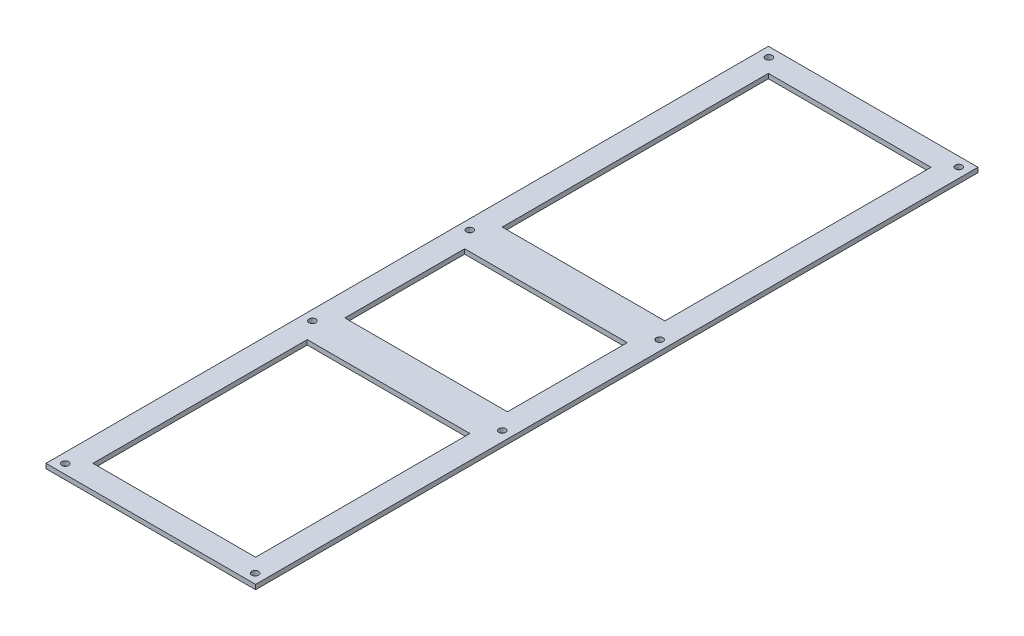
ISO-10303-21;
HEADER;
FILE_DESCRIPTION(('STEP AP214'),'2;1');
FILE_NAME('part.step','',(''),(''),'','','');
FILE_SCHEMA(('AUTOMOTIVE_DESIGN { 1 0 10303 214 1 1 1 1 }'));
ENDSEC;
DATA;
#1=APPLICATION_CONTEXT('core data for automotive mechanical design processes');
#2=APPLICATION_PROTOCOL_DEFINITION('international standard','automotive_design',2000,#1);
#3=PRODUCT_CONTEXT('',#1,'mechanical');
#4=PRODUCT('Part','Part','',(#3));
#5=PRODUCT_RELATED_PRODUCT_CATEGORY('part','',(#4));
#6=PRODUCT_DEFINITION_FORMATION('','',#4);
#7=PRODUCT_DEFINITION_CONTEXT('part definition',#1,'design');
#8=PRODUCT_DEFINITION('design','',#6,#7);
#9=PRODUCT_DEFINITION_SHAPE('','',#8);
#10=(LENGTH_UNIT() NAMED_UNIT(*) SI_UNIT(.MILLI.,.METRE.));
#11=(NAMED_UNIT(*) PLANE_ANGLE_UNIT() SI_UNIT($,.RADIAN.));
#12=(NAMED_UNIT(*) SI_UNIT($,.STERADIAN.) SOLID_ANGLE_UNIT());
#13=UNCERTAINTY_MEASURE_WITH_UNIT(LENGTH_MEASURE(1.E-05),#10,'distance_accuracy_value','');
#14=(GEOMETRIC_REPRESENTATION_CONTEXT(3) GLOBAL_UNCERTAINTY_ASSIGNED_CONTEXT((#13)) GLOBAL_UNIT_ASSIGNED_CONTEXT((#10,
#11,#12)) REPRESENTATION_CONTEXT('',''));
#15=CARTESIAN_POINT('',(0.,0.,0.));
#16=DIRECTION('',(0.,0.,1.));
#17=DIRECTION('',(1.,0.,0.));
#18=AXIS2_PLACEMENT_3D('',#15,#16,#17);
#19=CARTESIAN_POINT('',(0.,2.,0.));
#20=DIRECTION('',(0.,-1.,0.));
#21=DIRECTION('',(0.,0.,-1.));
#22=AXIS2_PLACEMENT_3D('',#19,#20,#21);
#23=PLANE('',#22);
#24=CARTESIAN_POINT('',(85.025,2.,-4.));
#25=DIRECTION('',(0.,1.,0.));
#26=DIRECTION('',(0.,0.,1.));
#27=AXIS2_PLACEMENT_3D('',#24,#25,#26);
#28=CIRCLE('',#27,1.44999999999999);
#29=CARTESIAN_POINT('',(85.025,2.,-2.55000000000001));
#30=VERTEX_POINT('',#29);
#31=EDGE_CURVE('E412',#30,#30,#28,.T.);
#32=ORIENTED_EDGE('',*,*,#31,.F.);
#33=EDGE_LOOP('',(#32));
#34=FACE_BOUND('',#33,.T.);
#35=CARTESIAN_POINT('',(4.2,2.,-4.));
#36=DIRECTION('',(0.,1.,0.));
#37=DIRECTION('',(0.,0.,1.));
#38=AXIS2_PLACEMENT_3D('',#35,#36,#37);
#39=CIRCLE('',#38,1.44999999999999);
#40=CARTESIAN_POINT('',(4.2,2.,-2.55000000000001));
#41=VERTEX_POINT('',#40);
#42=EDGE_CURVE('E414',#41,#41,#39,.T.);
#43=ORIENTED_EDGE('',*,*,#42,.F.);
#44=EDGE_LOOP('',(#43));
#45=FACE_BOUND('',#44,.T.);
#46=CARTESIAN_POINT('',(4.2,2.,-109.2));
#47=DIRECTION('',(0.,1.,0.));
#48=DIRECTION('',(0.,0.,1.));
#49=AXIS2_PLACEMENT_3D('',#46,#47,#48);
#50=CIRCLE('',#49,1.44999999999999);
#51=CARTESIAN_POINT('',(4.2,2.,-107.75));
#52=VERTEX_POINT('',#51);
#53=EDGE_CURVE('E422',#52,#52,#50,.T.);
#54=ORIENTED_EDGE('',*,*,#53,.F.);
#55=EDGE_LOOP('',(#54));
#56=FACE_BOUND('',#55,.T.);
#57=CARTESIAN_POINT('',(4.2,2.,-176.2));
#58=DIRECTION('',(0.,1.,0.));
#59=DIRECTION('',(0.,0.,1.));
#60=AXIS2_PLACEMENT_3D('',#57,#58,#59);
#61=CIRCLE('',#60,1.44999999999999);
#62=CARTESIAN_POINT('',(4.2,2.,-174.75));
#63=VERTEX_POINT('',#62);
#64=EDGE_CURVE('E428',#63,#63,#61,.T.);
#65=ORIENTED_EDGE('',*,*,#64,.F.);
#66=EDGE_LOOP('',(#65));
#67=FACE_BOUND('',#66,.T.);
#68=CARTESIAN_POINT('',(4.2,2.,-303.5));
#69=DIRECTION('',(0.,1.,0.));
#70=DIRECTION('',(0.,0.,1.));
#71=AXIS2_PLACEMENT_3D('',#68,#69,#70);
#72=CIRCLE('',#71,1.44999999999999);
#73=CARTESIAN_POINT('',(4.2,2.,-302.05));
#74=VERTEX_POINT('',#73);
#75=EDGE_CURVE('E434',#74,#74,#72,.T.);
#76=ORIENTED_EDGE('',*,*,#75,.F.);
#77=EDGE_LOOP('',(#76));
#78=FACE_BOUND('',#77,.T.);
#79=CARTESIAN_POINT('',(85.025,2.,-303.5));
#80=DIRECTION('',(0.,1.,0.));
#81=DIRECTION('',(0.,0.,1.));
#82=AXIS2_PLACEMENT_3D('',#79,#80,#81);
#83=CIRCLE('',#82,1.44999999999999);
#84=CARTESIAN_POINT('',(85.025,2.,-302.05));
#85=VERTEX_POINT('',#84);
#86=EDGE_CURVE('E440',#85,#85,#83,.T.);
#87=ORIENTED_EDGE('',*,*,#86,.F.);
#88=EDGE_LOOP('',(#87));
#89=FACE_BOUND('',#88,.T.);
#90=CARTESIAN_POINT('',(85.025,2.,-176.2));
#91=DIRECTION('',(0.,1.,0.));
#92=DIRECTION('',(0.,0.,1.));
#93=AXIS2_PLACEMENT_3D('',#90,#91,#92);
#94=CIRCLE('',#93,1.44999999999999);
#95=CARTESIAN_POINT('',(85.025,2.,-174.75));
#96=VERTEX_POINT('',#95);
#97=EDGE_CURVE('E446',#96,#96,#94,.T.);
#98=ORIENTED_EDGE('',*,*,#97,.F.);
#99=EDGE_LOOP('',(#98));
#100=FACE_BOUND('',#99,.T.);
#101=CARTESIAN_POINT('',(85.025,2.,-109.2));
#102=DIRECTION('',(0.,1.,0.));
#103=DIRECTION('',(0.,0.,1.));
#104=AXIS2_PLACEMENT_3D('',#101,#102,#103);
#105=CIRCLE('',#104,1.44999999999999);
#106=CARTESIAN_POINT('',(85.025,2.,-107.75));
#107=VERTEX_POINT('',#106);
#108=EDGE_CURVE('E452',#107,#107,#105,.T.);
#109=ORIENTED_EDGE('',*,*,#108,.F.);
#110=EDGE_LOOP('',(#109));
#111=FACE_BOUND('',#110,.T.);
#112=DIRECTION('',(0.,0.,1.));
#113=VECTOR('',#112,1.);
#114=CARTESIAN_POINT('',(10.,2.,-117.2));
#115=LINE('',#114,#113);
#116=CARTESIAN_POINT('',(10.,2.,-168.2));
#117=VERTEX_POINT('',#116);
#118=CARTESIAN_POINT('',(10.,2.,-117.2));
#119=VERTEX_POINT('',#118);
#120=EDGE_CURVE('E189',#117,#119,#115,.T.);
#121=ORIENTED_EDGE('',*,*,#120,.F.);
#122=DIRECTION('',(-1.,0.,0.));
#123=VECTOR('',#122,1.);
#124=CARTESIAN_POINT('',(10.,2.,-168.2));
#125=LINE('',#124,#123);
#126=CARTESIAN_POINT('',(79.2250000000001,2.,-168.2));
#127=VERTEX_POINT('',#126);
#128=EDGE_CURVE('E197',#127,#117,#125,.T.);
#129=ORIENTED_EDGE('',*,*,#128,.F.);
#130=DIRECTION('',(0.,0.,-1.));
#131=VECTOR('',#130,1.);
#132=CARTESIAN_POINT('',(79.2250000000001,2.,-117.2));
#133=LINE('',#132,#131);
#134=CARTESIAN_POINT('',(79.2250000000001,2.,-117.2));
#135=VERTEX_POINT('',#134);
#136=EDGE_CURVE('E194',#135,#127,#133,.T.);
#137=ORIENTED_EDGE('',*,*,#136,.F.);
#138=DIRECTION('',(1.,0.,0.));
#139=VECTOR('',#138,1.);
#140=CARTESIAN_POINT('',(10.,2.,-117.2));
#141=LINE('',#140,#139);
#142=EDGE_CURVE('E191',#119,#135,#141,.T.);
#143=ORIENTED_EDGE('',*,*,#142,.F.);
#144=EDGE_LOOP('',(#121,#129,#137,#143));
#145=FACE_BOUND('',#144,.T.);
#146=DIRECTION('',(0.,0.,1.));
#147=VECTOR('',#146,1.);
#148=CARTESIAN_POINT('',(0.,2.,0.));
#149=LINE('',#148,#147);
#150=CARTESIAN_POINT('',(0.,2.,-307.5));
#151=VERTEX_POINT('',#150);
#152=CARTESIAN_POINT('',(0.,2.,0.));
#153=VERTEX_POINT('',#152);
#154=EDGE_CURVE('E251',#151,#153,#149,.T.);
#155=ORIENTED_EDGE('',*,*,#154,.T.);
#156=DIRECTION('',(1.,0.,0.));
#157=VECTOR('',#156,1.);
#158=CARTESIAN_POINT('',(0.,2.,0.));
#159=LINE('',#158,#157);
#160=CARTESIAN_POINT('',(89.225,2.,0.));
#161=VERTEX_POINT('',#160);
#162=EDGE_CURVE('E254',#153,#161,#159,.T.);
#163=ORIENTED_EDGE('',*,*,#162,.T.);
#164=DIRECTION('',(0.,0.,-1.));
#165=VECTOR('',#164,1.);
#166=CARTESIAN_POINT('',(89.225,2.,0.));
#167=LINE('',#166,#165);
#168=CARTESIAN_POINT('',(89.225,2.,-307.5));
#169=VERTEX_POINT('',#168);
#170=EDGE_CURVE('E257',#161,#169,#167,.T.);
#171=ORIENTED_EDGE('',*,*,#170,.T.);
#172=DIRECTION('',(-1.,0.,0.));
#173=VECTOR('',#172,1.);
#174=CARTESIAN_POINT('',(0.,2.,-307.5));
#175=LINE('',#174,#173);
#176=EDGE_CURVE('E259',#169,#151,#175,.T.);
#177=ORIENTED_EDGE('',*,*,#176,.T.);
#178=EDGE_LOOP('',(#155,#163,#171,#177));
#179=FACE_BOUND('',#178,.T.);
#180=DIRECTION('',(1.,0.,0.));
#181=VECTOR('',#180,1.);
#182=CARTESIAN_POINT('',(10.,2.,-10.));
#183=LINE('',#182,#181);
#184=CARTESIAN_POINT('',(10.,2.,-10.));
#185=VERTEX_POINT('',#184);
#186=CARTESIAN_POINT('',(79.2250000000001,2.,-10.));
#187=VERTEX_POINT('',#186);
#188=EDGE_CURVE('E222',#185,#187,#183,.T.);
#189=ORIENTED_EDGE('',*,*,#188,.F.);
#190=DIRECTION('',(0.,0.,1.));
#191=VECTOR('',#190,1.);
#192=CARTESIAN_POINT('',(10.,2.,-10.));
#193=LINE('',#192,#191);
#194=CARTESIAN_POINT('',(10.,2.,-101.2));
#195=VERTEX_POINT('',#194);
#196=EDGE_CURVE('E220',#195,#185,#193,.T.);
#197=ORIENTED_EDGE('',*,*,#196,.F.);
#198=DIRECTION('',(-1.,0.,0.));
#199=VECTOR('',#198,1.);
#200=CARTESIAN_POINT('',(10.,2.,-101.2));
#201=LINE('',#200,#199);
#202=CARTESIAN_POINT('',(79.2250000000001,2.,-101.2));
#203=VERTEX_POINT('',#202);
#204=EDGE_CURVE('E227',#203,#195,#201,.T.);
#205=ORIENTED_EDGE('',*,*,#204,.F.);
#206=DIRECTION('',(0.,0.,-1.));
#207=VECTOR('',#206,1.);
#208=CARTESIAN_POINT('',(79.2250000000001,2.,-10.));
#209=LINE('',#208,#207);
#210=EDGE_CURVE('E225',#187,#203,#209,.T.);
#211=ORIENTED_EDGE('',*,*,#210,.F.);
#212=EDGE_LOOP('',(#189,#197,#205,#211));
#213=FACE_BOUND('',#212,.T.);
#214=DIRECTION('',(0.,0.,1.));
#215=VECTOR('',#214,1.);
#216=CARTESIAN_POINT('',(10.,2.,-297.5));
#217=LINE('',#216,#215);
#218=CARTESIAN_POINT('',(10.,2.,-297.5));
#219=VERTEX_POINT('',#218);
#220=CARTESIAN_POINT('',(10.,2.,-184.2));
#221=VERTEX_POINT('',#220);
#222=EDGE_CURVE('E148',#219,#221,#217,.T.);
#223=ORIENTED_EDGE('',*,*,#222,.F.);
#224=DIRECTION('',(-1.,0.,0.));
#225=VECTOR('',#224,1.);
#226=CARTESIAN_POINT('',(10.,2.,-297.5));
#227=LINE('',#226,#225);
#228=CARTESIAN_POINT('',(79.225,2.,-297.5));
#229=VERTEX_POINT('',#228);
#230=EDGE_CURVE('E172',#229,#219,#227,.T.);
#231=ORIENTED_EDGE('',*,*,#230,.F.);
#232=DIRECTION('',(0.,0.,-1.));
#233=VECTOR('',#232,1.);
#234=CARTESIAN_POINT('',(79.225,2.,-209.2));
#235=LINE('',#234,#233);
#236=CARTESIAN_POINT('',(79.225,2.,-184.2));
#237=VERTEX_POINT('',#236);
#238=EDGE_CURVE('E170',#237,#229,#235,.T.);
#239=ORIENTED_EDGE('',*,*,#238,.F.);
#240=DIRECTION('',(1.,0.,0.));
#241=VECTOR('',#240,1.);
#242=CARTESIAN_POINT('',(10.,2.,-184.2));
#243=LINE('',#242,#241);
#244=EDGE_CURVE('E156',#221,#237,#243,.T.);
#245=ORIENTED_EDGE('',*,*,#244,.F.);
#246=EDGE_LOOP('',(#223,#231,#239,#245));
#247=FACE_BOUND('',#246,.T.);
#248=ADVANCED_FACE('F37',(#34,#45,#56,#67,#78,#89,#100,#111,#145,#179,#213,#247),#23,.F.);
#249=CARTESIAN_POINT('',(0.,0.,0.));
#250=DIRECTION('',(0.,-1.,0.));
#251=DIRECTION('',(0.,0.,-1.));
#252=AXIS2_PLACEMENT_3D('',#249,#250,#251);
#253=PLANE('',#252);
#254=CARTESIAN_POINT('',(85.025,0.,-4.));
#255=DIRECTION('',(0.,1.,0.));
#256=DIRECTION('',(0.,0.,1.));
#257=AXIS2_PLACEMENT_3D('',#254,#255,#256);
#258=CIRCLE('',#257,1.44999999999999);
#259=CARTESIAN_POINT('',(85.025,0.,-2.55000000000001));
#260=VERTEX_POINT('',#259);
#261=EDGE_CURVE('E410',#260,#260,#258,.T.);
#262=ORIENTED_EDGE('',*,*,#261,.T.);
#263=EDGE_LOOP('',(#262));
#264=FACE_BOUND('',#263,.T.);
#265=CARTESIAN_POINT('',(4.2,0.,-4.));
#266=DIRECTION('',(0.,1.,0.));
#267=DIRECTION('',(0.,0.,1.));
#268=AXIS2_PLACEMENT_3D('',#265,#266,#267);
#269=CIRCLE('',#268,1.44999999999999);
#270=CARTESIAN_POINT('',(4.2,0.,-2.55000000000001));
#271=VERTEX_POINT('',#270);
#272=EDGE_CURVE('E419',#271,#271,#269,.T.);
#273=ORIENTED_EDGE('',*,*,#272,.T.);
#274=EDGE_LOOP('',(#273));
#275=FACE_BOUND('',#274,.T.);
#276=CARTESIAN_POINT('',(4.2,0.,-109.2));
#277=DIRECTION('',(0.,1.,0.));
#278=DIRECTION('',(0.,0.,1.));
#279=AXIS2_PLACEMENT_3D('',#276,#277,#278);
#280=CIRCLE('',#279,1.44999999999999);
#281=CARTESIAN_POINT('',(4.2,0.,-107.75));
#282=VERTEX_POINT('',#281);
#283=EDGE_CURVE('E425',#282,#282,#280,.T.);
#284=ORIENTED_EDGE('',*,*,#283,.T.);
#285=EDGE_LOOP('',(#284));
#286=FACE_BOUND('',#285,.T.);
#287=CARTESIAN_POINT('',(4.2,0.,-176.2));
#288=DIRECTION('',(0.,1.,0.));
#289=DIRECTION('',(0.,0.,1.));
#290=AXIS2_PLACEMENT_3D('',#287,#288,#289);
#291=CIRCLE('',#290,1.44999999999999);
#292=CARTESIAN_POINT('',(4.2,0.,-174.75));
#293=VERTEX_POINT('',#292);
#294=EDGE_CURVE('E431',#293,#293,#291,.T.);
#295=ORIENTED_EDGE('',*,*,#294,.T.);
#296=EDGE_LOOP('',(#295));
#297=FACE_BOUND('',#296,.T.);
#298=CARTESIAN_POINT('',(4.2,0.,-303.5));
#299=DIRECTION('',(0.,1.,0.));
#300=DIRECTION('',(0.,0.,1.));
#301=AXIS2_PLACEMENT_3D('',#298,#299,#300);
#302=CIRCLE('',#301,1.44999999999999);
#303=CARTESIAN_POINT('',(4.2,0.,-302.05));
#304=VERTEX_POINT('',#303);
#305=EDGE_CURVE('E437',#304,#304,#302,.T.);
#306=ORIENTED_EDGE('',*,*,#305,.T.);
#307=EDGE_LOOP('',(#306));
#308=FACE_BOUND('',#307,.T.);
#309=CARTESIAN_POINT('',(85.025,0.,-303.5));
#310=DIRECTION('',(0.,1.,0.));
#311=DIRECTION('',(0.,0.,1.));
#312=AXIS2_PLACEMENT_3D('',#309,#310,#311);
#313=CIRCLE('',#312,1.44999999999999);
#314=CARTESIAN_POINT('',(85.025,0.,-302.05));
#315=VERTEX_POINT('',#314);
#316=EDGE_CURVE('E443',#315,#315,#313,.T.);
#317=ORIENTED_EDGE('',*,*,#316,.T.);
#318=EDGE_LOOP('',(#317));
#319=FACE_BOUND('',#318,.T.);
#320=CARTESIAN_POINT('',(85.025,0.,-176.2));
#321=DIRECTION('',(0.,1.,0.));
#322=DIRECTION('',(0.,0.,1.));
#323=AXIS2_PLACEMENT_3D('',#320,#321,#322);
#324=CIRCLE('',#323,1.44999999999999);
#325=CARTESIAN_POINT('',(85.025,0.,-174.75));
#326=VERTEX_POINT('',#325);
#327=EDGE_CURVE('E449',#326,#326,#324,.T.);
#328=ORIENTED_EDGE('',*,*,#327,.T.);
#329=EDGE_LOOP('',(#328));
#330=FACE_BOUND('',#329,.T.);
#331=CARTESIAN_POINT('',(85.025,0.,-109.2));
#332=DIRECTION('',(0.,1.,0.));
#333=DIRECTION('',(0.,0.,1.));
#334=AXIS2_PLACEMENT_3D('',#331,#332,#333);
#335=CIRCLE('',#334,1.44999999999999);
#336=CARTESIAN_POINT('',(85.025,0.,-107.75));
#337=VERTEX_POINT('',#336);
#338=EDGE_CURVE('E179',#337,#337,#335,.T.);
#339=ORIENTED_EDGE('',*,*,#338,.T.);
#340=EDGE_LOOP('',(#339));
#341=FACE_BOUND('',#340,.T.);
#342=DIRECTION('',(0.,0.,1.));
#343=VECTOR('',#342,1.);
#344=CARTESIAN_POINT('',(0.,0.,0.));
#345=LINE('',#344,#343);
#346=CARTESIAN_POINT('',(0.,0.,-307.5));
#347=VERTEX_POINT('',#346);
#348=CARTESIAN_POINT('',(0.,0.,0.));
#349=VERTEX_POINT('',#348);
#350=EDGE_CURVE('E250',#347,#349,#345,.T.);
#351=ORIENTED_EDGE('',*,*,#350,.F.);
#352=DIRECTION('',(-1.,0.,0.));
#353=VECTOR('',#352,1.);
#354=CARTESIAN_POINT('',(0.,0.,-307.5));
#355=LINE('',#354,#353);
#356=CARTESIAN_POINT('',(89.225,0.,-307.5));
#357=VERTEX_POINT('',#356);
#358=EDGE_CURVE('E255',#357,#347,#355,.T.);
#359=ORIENTED_EDGE('',*,*,#358,.F.);
#360=DIRECTION('',(0.,0.,-1.));
#361=VECTOR('',#360,1.);
#362=CARTESIAN_POINT('',(89.225,0.,0.));
#363=LINE('',#362,#361);
#364=CARTESIAN_POINT('',(89.225,0.,0.));
#365=VERTEX_POINT('',#364);
#366=EDGE_CURVE('E266',#365,#357,#363,.T.);
#367=ORIENTED_EDGE('',*,*,#366,.F.);
#368=DIRECTION('',(1.,0.,0.));
#369=VECTOR('',#368,1.);
#370=CARTESIAN_POINT('',(0.,0.,0.));
#371=LINE('',#370,#369);
#372=EDGE_CURVE('E264',#349,#365,#371,.T.);
#373=ORIENTED_EDGE('',*,*,#372,.F.);
#374=EDGE_LOOP('',(#351,#359,#367,#373));
#375=FACE_BOUND('',#374,.T.);
#376=DIRECTION('',(0.,0.,1.));
#377=VECTOR('',#376,1.);
#378=CARTESIAN_POINT('',(10.,0.,-21.8));
#379=LINE('',#378,#377);
#380=CARTESIAN_POINT('',(10.,0.,-101.2));
#381=VERTEX_POINT('',#380);
#382=CARTESIAN_POINT('',(10.,0.,-10.));
#383=VERTEX_POINT('',#382);
#384=EDGE_CURVE('E223',#381,#383,#379,.T.);
#385=ORIENTED_EDGE('',*,*,#384,.T.);
#386=DIRECTION('',(1.,0.,0.));
#387=VECTOR('',#386,1.);
#388=CARTESIAN_POINT('',(10.,0.,-10.));
#389=LINE('',#388,#387);
#390=CARTESIAN_POINT('',(79.2250000000001,0.,-10.));
#391=VERTEX_POINT('',#390);
#392=EDGE_CURVE('E219',#383,#391,#389,.T.);
#393=ORIENTED_EDGE('',*,*,#392,.T.);
#394=DIRECTION('',(0.,0.,-1.));
#395=VECTOR('',#394,1.);
#396=CARTESIAN_POINT('',(79.2250000000001,0.,-81.2));
#397=LINE('',#396,#395);
#398=CARTESIAN_POINT('',(79.2250000000001,0.,-101.2));
#399=VERTEX_POINT('',#398);
#400=EDGE_CURVE('E233',#391,#399,#397,.T.);
#401=ORIENTED_EDGE('',*,*,#400,.T.);
#402=DIRECTION('',(-1.,0.,0.));
#403=VECTOR('',#402,1.);
#404=CARTESIAN_POINT('',(10.,0.,-101.2));
#405=LINE('',#404,#403);
#406=EDGE_CURVE('E236',#399,#381,#405,.T.);
#407=ORIENTED_EDGE('',*,*,#406,.T.);
#408=EDGE_LOOP('',(#385,#393,#401,#407));
#409=FACE_BOUND('',#408,.T.);
#410=DIRECTION('',(-1.,0.,0.));
#411=VECTOR('',#410,1.);
#412=CARTESIAN_POINT('',(10.,0.,-168.2));
#413=LINE('',#412,#411);
#414=CARTESIAN_POINT('',(79.2250000000001,0.,-168.2));
#415=VERTEX_POINT('',#414);
#416=CARTESIAN_POINT('',(10.,0.,-168.2));
#417=VERTEX_POINT('',#416);
#418=EDGE_CURVE('E192',#415,#417,#413,.T.);
#419=ORIENTED_EDGE('',*,*,#418,.T.);
#420=DIRECTION('',(0.,0.,1.));
#421=VECTOR('',#420,1.);
#422=CARTESIAN_POINT('',(10.,0.,-117.2));
#423=LINE('',#422,#421);
#424=CARTESIAN_POINT('',(10.,0.,-117.2));
#425=VERTEX_POINT('',#424);
#426=EDGE_CURVE('E166',#417,#425,#423,.T.);
#427=ORIENTED_EDGE('',*,*,#426,.T.);
#428=DIRECTION('',(1.,0.,0.));
#429=VECTOR('',#428,1.);
#430=CARTESIAN_POINT('',(10.,0.,-117.2));
#431=LINE('',#430,#429);
#432=CARTESIAN_POINT('',(79.2250000000001,0.,-117.2));
#433=VERTEX_POINT('',#432);
#434=EDGE_CURVE('E202',#425,#433,#431,.T.);
#435=ORIENTED_EDGE('',*,*,#434,.T.);
#436=DIRECTION('',(0.,0.,-1.));
#437=VECTOR('',#436,1.);
#438=CARTESIAN_POINT('',(79.2250000000001,0.,-117.2));
#439=LINE('',#438,#437);
#440=EDGE_CURVE('E205',#433,#415,#439,.T.);
#441=ORIENTED_EDGE('',*,*,#440,.T.);
#442=EDGE_LOOP('',(#419,#427,#435,#441));
#443=FACE_BOUND('',#442,.T.);
#444=DIRECTION('',(-1.,0.,0.));
#445=VECTOR('',#444,1.);
#446=CARTESIAN_POINT('',(10.,0.,-297.5));
#447=LINE('',#446,#445);
#448=CARTESIAN_POINT('',(79.225,0.,-297.5));
#449=VERTEX_POINT('',#448);
#450=CARTESIAN_POINT('',(10.,0.,-297.5));
#451=VERTEX_POINT('',#450);
#452=EDGE_CURVE('E157',#449,#451,#447,.T.);
#453=ORIENTED_EDGE('',*,*,#452,.T.);
#454=DIRECTION('',(0.,0.,1.));
#455=VECTOR('',#454,1.);
#456=CARTESIAN_POINT('',(9.99999999999999,0.,-209.2));
#457=LINE('',#456,#455);
#458=CARTESIAN_POINT('',(10.,0.,-184.2));
#459=VERTEX_POINT('',#458);
#460=EDGE_CURVE('E177',#451,#459,#457,.T.);
#461=ORIENTED_EDGE('',*,*,#460,.T.);
#462=DIRECTION('',(1.,0.,0.));
#463=VECTOR('',#462,1.);
#464=CARTESIAN_POINT('',(10.,0.,-184.2));
#465=LINE('',#464,#463);
#466=CARTESIAN_POINT('',(79.225,0.,-184.2));
#467=VERTEX_POINT('',#466);
#468=EDGE_CURVE('E164',#459,#467,#465,.T.);
#469=ORIENTED_EDGE('',*,*,#468,.T.);
#470=DIRECTION('',(0.,0.,-1.));
#471=VECTOR('',#470,1.);
#472=CARTESIAN_POINT('',(79.225,0.,-297.5));
#473=LINE('',#472,#471);
#474=EDGE_CURVE('E181',#467,#449,#473,.T.);
#475=ORIENTED_EDGE('',*,*,#474,.T.);
#476=EDGE_LOOP('',(#453,#461,#469,#475));
#477=FACE_BOUND('',#476,.T.);
#478=ADVANCED_FACE('F284',(#264,#275,#286,#297,#308,#319,#330,#341,#375,#409,#443,#477),#253,.T.);
#479=CARTESIAN_POINT('',(0.,2.,0.));
#480=DIRECTION('',(1.,0.,0.));
#481=DIRECTION('',(0.,0.,-1.));
#482=AXIS2_PLACEMENT_3D('',#479,#480,#481);
#483=PLANE('',#482);
#484=ORIENTED_EDGE('',*,*,#350,.T.);
#485=DIRECTION('',(0.,-1.,0.));
#486=VECTOR('',#485,1.);
#487=CARTESIAN_POINT('',(0.,2.,0.));
#488=LINE('',#487,#486);
#489=EDGE_CURVE('E11',#153,#349,#488,.T.);
#490=ORIENTED_EDGE('',*,*,#489,.F.);
#491=ORIENTED_EDGE('',*,*,#154,.F.);
#492=DIRECTION('',(0.,-1.,0.));
#493=VECTOR('',#492,1.);
#494=CARTESIAN_POINT('',(0.,2.,-307.5));
#495=LINE('',#494,#493);
#496=EDGE_CURVE('E261',#151,#347,#495,.T.);
#497=ORIENTED_EDGE('',*,*,#496,.T.);
#498=EDGE_LOOP('',(#484,#490,#491,#497));
#499=FACE_BOUND('',#498,.T.);
#500=ADVANCED_FACE('F39',(#499),#483,.F.);
#501=CARTESIAN_POINT('',(0.,2.,0.));
#502=DIRECTION('',(0.,0.,-1.));
#503=DIRECTION('',(-1.,0.,0.));
#504=AXIS2_PLACEMENT_3D('',#501,#502,#503);
#505=PLANE('',#504);
#506=ORIENTED_EDGE('',*,*,#372,.T.);
#507=DIRECTION('',(0.,-1.,0.));
#508=VECTOR('',#507,1.);
#509=CARTESIAN_POINT('',(89.225,2.,0.));
#510=LINE('',#509,#508);
#511=EDGE_CURVE('E45',#161,#365,#510,.T.);
#512=ORIENTED_EDGE('',*,*,#511,.F.);
#513=ORIENTED_EDGE('',*,*,#162,.F.);
#514=ORIENTED_EDGE('',*,*,#489,.T.);
#515=EDGE_LOOP('',(#506,#512,#513,#514));
#516=FACE_BOUND('',#515,.T.);
#517=ADVANCED_FACE('F295',(#516),#505,.F.);
#518=CARTESIAN_POINT('',(89.225,2.,0.));
#519=DIRECTION('',(-1.,0.,0.));
#520=DIRECTION('',(0.,0.,1.));
#521=AXIS2_PLACEMENT_3D('',#518,#519,#520);
#522=PLANE('',#521);
#523=ORIENTED_EDGE('',*,*,#366,.T.);
#524=DIRECTION('',(0.,-1.,0.));
#525=VECTOR('',#524,1.);
#526=CARTESIAN_POINT('',(89.225,2.,-307.5));
#527=LINE('',#526,#525);
#528=EDGE_CURVE('E271',#169,#357,#527,.T.);
#529=ORIENTED_EDGE('',*,*,#528,.F.);
#530=ORIENTED_EDGE('',*,*,#170,.F.);
#531=ORIENTED_EDGE('',*,*,#511,.T.);
#532=EDGE_LOOP('',(#523,#529,#530,#531));
#533=FACE_BOUND('',#532,.T.);
#534=ADVANCED_FACE('F278',(#533),#522,.F.);
#535=CARTESIAN_POINT('',(0.,2.,-307.5));
#536=DIRECTION('',(0.,0.,1.));
#537=DIRECTION('',(1.,0.,0.));
#538=AXIS2_PLACEMENT_3D('',#535,#536,#537);
#539=PLANE('',#538);
#540=ORIENTED_EDGE('',*,*,#358,.T.);
#541=ORIENTED_EDGE('',*,*,#496,.F.);
#542=ORIENTED_EDGE('',*,*,#176,.F.);
#543=ORIENTED_EDGE('',*,*,#528,.T.);
#544=EDGE_LOOP('',(#540,#541,#542,#543));
#545=FACE_BOUND('',#544,.T.);
#546=ADVANCED_FACE('F288',(#545),#539,.F.);
#547=CARTESIAN_POINT('',(10.,2.,-10.));
#548=DIRECTION('',(0.,0.,-1.));
#549=DIRECTION('',(-1.,0.,0.));
#550=AXIS2_PLACEMENT_3D('',#547,#548,#549);
#551=PLANE('',#550);
#552=ORIENTED_EDGE('',*,*,#392,.F.);
#553=DIRECTION('',(0.,-1.,0.));
#554=VECTOR('',#553,1.);
#555=CARTESIAN_POINT('',(10.,2.,-10.));
#556=LINE('',#555,#554);
#557=EDGE_CURVE('E248',#185,#383,#556,.T.);
#558=ORIENTED_EDGE('',*,*,#557,.F.);
#559=ORIENTED_EDGE('',*,*,#188,.T.);
#560=DIRECTION('',(0.,-1.,0.));
#561=VECTOR('',#560,1.);
#562=CARTESIAN_POINT('',(79.2250000000001,2.,-10.));
#563=LINE('',#562,#561);
#564=EDGE_CURVE('E245',#187,#391,#563,.T.);
#565=ORIENTED_EDGE('',*,*,#564,.T.);
#566=EDGE_LOOP('',(#552,#558,#559,#565));
#567=FACE_BOUND('',#566,.T.);
#568=ADVANCED_FACE('F313',(#567),#551,.T.);
#569=CARTESIAN_POINT('',(79.2250000000001,2.,-81.2));
#570=DIRECTION('',(-1.,0.,0.));
#571=DIRECTION('',(0.,0.,1.));
#572=AXIS2_PLACEMENT_3D('',#569,#570,#571);
#573=PLANE('',#572);
#574=ORIENTED_EDGE('',*,*,#400,.F.);
#575=ORIENTED_EDGE('',*,*,#564,.F.);
#576=ORIENTED_EDGE('',*,*,#210,.T.);
#577=DIRECTION('',(0.,-1.,0.));
#578=VECTOR('',#577,1.);
#579=CARTESIAN_POINT('',(79.2250000000001,2.,-101.2));
#580=LINE('',#579,#578);
#581=EDGE_CURVE('E243',#203,#399,#580,.T.);
#582=ORIENTED_EDGE('',*,*,#581,.T.);
#583=EDGE_LOOP('',(#574,#575,#576,#582));
#584=FACE_BOUND('',#583,.T.);
#585=ADVANCED_FACE('F320',(#584),#573,.T.);
#586=CARTESIAN_POINT('',(10.,2.,-101.2));
#587=DIRECTION('',(0.,0.,1.));
#588=DIRECTION('',(1.,0.,0.));
#589=AXIS2_PLACEMENT_3D('',#586,#587,#588);
#590=PLANE('',#589);
#591=ORIENTED_EDGE('',*,*,#406,.F.);
#592=ORIENTED_EDGE('',*,*,#581,.F.);
#593=ORIENTED_EDGE('',*,*,#204,.T.);
#594=DIRECTION('',(0.,-1.,0.));
#595=VECTOR('',#594,1.);
#596=CARTESIAN_POINT('',(10.,2.,-101.2));
#597=LINE('',#596,#595);
#598=EDGE_CURVE('E230',#195,#381,#597,.T.);
#599=ORIENTED_EDGE('',*,*,#598,.T.);
#600=EDGE_LOOP('',(#591,#592,#593,#599));
#601=FACE_BOUND('',#600,.T.);
#602=ADVANCED_FACE('F325',(#601),#590,.T.);
#603=CARTESIAN_POINT('',(10.,2.,-21.8));
#604=DIRECTION('',(1.,0.,0.));
#605=DIRECTION('',(0.,0.,-1.));
#606=AXIS2_PLACEMENT_3D('',#603,#604,#605);
#607=PLANE('',#606);
#608=ORIENTED_EDGE('',*,*,#384,.F.);
#609=ORIENTED_EDGE('',*,*,#598,.F.);
#610=ORIENTED_EDGE('',*,*,#196,.T.);
#611=ORIENTED_EDGE('',*,*,#557,.T.);
#612=EDGE_LOOP('',(#608,#609,#610,#611));
#613=FACE_BOUND('',#612,.T.);
#614=ADVANCED_FACE('F334',(#613),#607,.T.);
#615=CARTESIAN_POINT('',(10.,2.,-117.2));
#616=DIRECTION('',(1.,0.,0.));
#617=DIRECTION('',(0.,0.,-1.));
#618=AXIS2_PLACEMENT_3D('',#615,#616,#617);
#619=PLANE('',#618);
#620=ORIENTED_EDGE('',*,*,#426,.F.);
#621=DIRECTION('',(0.,-1.,0.));
#622=VECTOR('',#621,1.);
#623=CARTESIAN_POINT('',(10.,2.,-168.2));
#624=LINE('',#623,#622);
#625=EDGE_CURVE('E199',#117,#417,#624,.T.);
#626=ORIENTED_EDGE('',*,*,#625,.F.);
#627=ORIENTED_EDGE('',*,*,#120,.T.);
#628=DIRECTION('',(0.,-1.,0.));
#629=VECTOR('',#628,1.);
#630=CARTESIAN_POINT('',(10.,2.,-117.2));
#631=LINE('',#630,#629);
#632=EDGE_CURVE('E216',#119,#425,#631,.T.);
#633=ORIENTED_EDGE('',*,*,#632,.T.);
#634=EDGE_LOOP('',(#620,#626,#627,#633));
#635=FACE_BOUND('',#634,.T.);
#636=ADVANCED_FACE('F345',(#635),#619,.T.);
#637=CARTESIAN_POINT('',(10.,2.,-117.2));
#638=DIRECTION('',(0.,0.,-1.));
#639=DIRECTION('',(-1.,0.,0.));
#640=AXIS2_PLACEMENT_3D('',#637,#638,#639);
#641=PLANE('',#640);
#642=ORIENTED_EDGE('',*,*,#434,.F.);
#643=ORIENTED_EDGE('',*,*,#632,.F.);
#644=ORIENTED_EDGE('',*,*,#142,.T.);
#645=DIRECTION('',(0.,-1.,0.));
#646=VECTOR('',#645,1.);
#647=CARTESIAN_POINT('',(79.2250000000001,2.,-117.2));
#648=LINE('',#647,#646);
#649=EDGE_CURVE('E214',#135,#433,#648,.T.);
#650=ORIENTED_EDGE('',*,*,#649,.T.);
#651=EDGE_LOOP('',(#642,#643,#644,#650));
#652=FACE_BOUND('',#651,.T.);
#653=ADVANCED_FACE('F350',(#652),#641,.T.);
#654=CARTESIAN_POINT('',(79.2250000000001,2.,-117.2));
#655=DIRECTION('',(-1.,0.,0.));
#656=DIRECTION('',(0.,0.,1.));
#657=AXIS2_PLACEMENT_3D('',#654,#655,#656);
#658=PLANE('',#657);
#659=ORIENTED_EDGE('',*,*,#440,.F.);
#660=ORIENTED_EDGE('',*,*,#649,.F.);
#661=ORIENTED_EDGE('',*,*,#136,.T.);
#662=DIRECTION('',(0.,-1.,0.));
#663=VECTOR('',#662,1.);
#664=CARTESIAN_POINT('',(79.2250000000001,2.,-168.2));
#665=LINE('',#664,#663);
#666=EDGE_CURVE('E212',#127,#415,#665,.T.);
#667=ORIENTED_EDGE('',*,*,#666,.T.);
#668=EDGE_LOOP('',(#659,#660,#661,#667));
#669=FACE_BOUND('',#668,.T.);
#670=ADVANCED_FACE('F354',(#669),#658,.T.);
#671=CARTESIAN_POINT('',(10.,2.,-168.2));
#672=DIRECTION('',(0.,0.,1.));
#673=DIRECTION('',(1.,0.,0.));
#674=AXIS2_PLACEMENT_3D('',#671,#672,#673);
#675=PLANE('',#674);
#676=ORIENTED_EDGE('',*,*,#418,.F.);
#677=ORIENTED_EDGE('',*,*,#666,.F.);
#678=ORIENTED_EDGE('',*,*,#128,.T.);
#679=ORIENTED_EDGE('',*,*,#625,.T.);
#680=EDGE_LOOP('',(#676,#677,#678,#679));
#681=FACE_BOUND('',#680,.T.);
#682=ADVANCED_FACE('F358',(#681),#675,.T.);
#683=CARTESIAN_POINT('',(9.99999999999999,2.,-209.2));
#684=DIRECTION('',(1.,0.,0.));
#685=DIRECTION('',(0.,0.,-1.));
#686=AXIS2_PLACEMENT_3D('',#683,#684,#685);
#687=PLANE('',#686);
#688=ORIENTED_EDGE('',*,*,#460,.F.);
#689=DIRECTION('',(0.,-1.,0.));
#690=VECTOR('',#689,1.);
#691=CARTESIAN_POINT('',(10.,2.,-297.5));
#692=LINE('',#691,#690);
#693=EDGE_CURVE('E57',#219,#451,#692,.T.);
#694=ORIENTED_EDGE('',*,*,#693,.F.);
#695=ORIENTED_EDGE('',*,*,#222,.T.);
#696=DIRECTION('',(0.,-1.,0.));
#697=VECTOR('',#696,1.);
#698=CARTESIAN_POINT('',(10.,2.,-184.2));
#699=LINE('',#698,#697);
#700=EDGE_CURVE('E151',#221,#459,#699,.T.);
#701=ORIENTED_EDGE('',*,*,#700,.T.);
#702=EDGE_LOOP('',(#688,#694,#695,#701));
#703=FACE_BOUND('',#702,.T.);
#704=ADVANCED_FACE('F150',(#703),#687,.T.);
#705=CARTESIAN_POINT('',(10.,2.,-184.2));
#706=DIRECTION('',(0.,0.,-1.));
#707=DIRECTION('',(-1.,0.,0.));
#708=AXIS2_PLACEMENT_3D('',#705,#706,#707);
#709=PLANE('',#708);
#710=ORIENTED_EDGE('',*,*,#468,.F.);
#711=ORIENTED_EDGE('',*,*,#700,.F.);
#712=ORIENTED_EDGE('',*,*,#244,.T.);
#713=DIRECTION('',(0.,-1.,0.));
#714=VECTOR('',#713,1.);
#715=CARTESIAN_POINT('',(79.225,2.,-184.2));
#716=LINE('',#715,#714);
#717=EDGE_CURVE('E167',#237,#467,#716,.T.);
#718=ORIENTED_EDGE('',*,*,#717,.T.);
#719=EDGE_LOOP('',(#710,#711,#712,#718));
#720=FACE_BOUND('',#719,.T.);
#721=ADVANCED_FACE('F160',(#720),#709,.T.);
#722=CARTESIAN_POINT('',(79.225,2.,-297.5));
#723=DIRECTION('',(-1.,0.,0.));
#724=DIRECTION('',(0.,0.,1.));
#725=AXIS2_PLACEMENT_3D('',#722,#723,#724);
#726=PLANE('',#725);
#727=ORIENTED_EDGE('',*,*,#474,.F.);
#728=ORIENTED_EDGE('',*,*,#717,.F.);
#729=ORIENTED_EDGE('',*,*,#238,.T.);
#730=DIRECTION('',(0.,-1.,0.));
#731=VECTOR('',#730,1.);
#732=CARTESIAN_POINT('',(79.225,2.,-297.5));
#733=LINE('',#732,#731);
#734=EDGE_CURVE('E52',#229,#449,#733,.T.);
#735=ORIENTED_EDGE('',*,*,#734,.T.);
#736=EDGE_LOOP('',(#727,#728,#729,#735));
#737=FACE_BOUND('',#736,.T.);
#738=ADVANCED_FACE('F367',(#737),#726,.T.);
#739=CARTESIAN_POINT('',(10.,2.,-297.5));
#740=DIRECTION('',(0.,0.,1.));
#741=DIRECTION('',(1.,0.,0.));
#742=AXIS2_PLACEMENT_3D('',#739,#740,#741);
#743=PLANE('',#742);
#744=ORIENTED_EDGE('',*,*,#452,.F.);
#745=ORIENTED_EDGE('',*,*,#734,.F.);
#746=ORIENTED_EDGE('',*,*,#230,.T.);
#747=ORIENTED_EDGE('',*,*,#693,.T.);
#748=EDGE_LOOP('',(#744,#745,#746,#747));
#749=FACE_BOUND('',#748,.T.);
#750=ADVANCED_FACE('F370',(#749),#743,.T.);
#751=CARTESIAN_POINT('',(85.025,2.,-109.2));
#752=DIRECTION('',(0.,1.,0.));
#753=DIRECTION('',(0.,0.,1.));
#754=AXIS2_PLACEMENT_3D('',#751,#752,#753);
#755=CYLINDRICAL_SURFACE('',#754,1.44999999999999);
#756=ORIENTED_EDGE('',*,*,#338,.F.);
#757=EDGE_LOOP('',(#756));
#758=FACE_BOUND('',#757,.T.);
#759=ORIENTED_EDGE('',*,*,#108,.T.);
#760=EDGE_LOOP('',(#759));
#761=FACE_BOUND('',#760,.T.);
#762=ADVANCED_FACE('F374',(#758,#761),#755,.F.);
#763=CARTESIAN_POINT('',(85.025,2.,-176.2));
#764=DIRECTION('',(0.,1.,0.));
#765=DIRECTION('',(0.,0.,1.));
#766=AXIS2_PLACEMENT_3D('',#763,#764,#765);
#767=CYLINDRICAL_SURFACE('',#766,1.44999999999999);
#768=ORIENTED_EDGE('',*,*,#327,.F.);
#769=EDGE_LOOP('',(#768));
#770=FACE_BOUND('',#769,.T.);
#771=ORIENTED_EDGE('',*,*,#97,.T.);
#772=EDGE_LOOP('',(#771));
#773=FACE_BOUND('',#772,.T.);
#774=ADVANCED_FACE('F377',(#770,#773),#767,.F.);
#775=CARTESIAN_POINT('',(85.025,2.,-303.5));
#776=DIRECTION('',(0.,1.,0.));
#777=DIRECTION('',(0.,0.,1.));
#778=AXIS2_PLACEMENT_3D('',#775,#776,#777);
#779=CYLINDRICAL_SURFACE('',#778,1.44999999999999);
#780=ORIENTED_EDGE('',*,*,#316,.F.);
#781=EDGE_LOOP('',(#780));
#782=FACE_BOUND('',#781,.T.);
#783=ORIENTED_EDGE('',*,*,#86,.T.);
#784=EDGE_LOOP('',(#783));
#785=FACE_BOUND('',#784,.T.);
#786=ADVANCED_FACE('F381',(#782,#785),#779,.F.);
#787=CARTESIAN_POINT('',(4.2,2.,-303.5));
#788=DIRECTION('',(0.,1.,0.));
#789=DIRECTION('',(0.,0.,1.));
#790=AXIS2_PLACEMENT_3D('',#787,#788,#789);
#791=CYLINDRICAL_SURFACE('',#790,1.44999999999999);
#792=ORIENTED_EDGE('',*,*,#305,.F.);
#793=EDGE_LOOP('',(#792));
#794=FACE_BOUND('',#793,.T.);
#795=ORIENTED_EDGE('',*,*,#75,.T.);
#796=EDGE_LOOP('',(#795));
#797=FACE_BOUND('',#796,.T.);
#798=ADVANCED_FACE('F385',(#794,#797),#791,.F.);
#799=CARTESIAN_POINT('',(4.2,2.,-176.2));
#800=DIRECTION('',(0.,1.,0.));
#801=DIRECTION('',(0.,0.,1.));
#802=AXIS2_PLACEMENT_3D('',#799,#800,#801);
#803=CYLINDRICAL_SURFACE('',#802,1.44999999999999);
#804=ORIENTED_EDGE('',*,*,#294,.F.);
#805=EDGE_LOOP('',(#804));
#806=FACE_BOUND('',#805,.T.);
#807=ORIENTED_EDGE('',*,*,#64,.T.);
#808=EDGE_LOOP('',(#807));
#809=FACE_BOUND('',#808,.T.);
#810=ADVANCED_FACE('F389',(#806,#809),#803,.F.);
#811=CARTESIAN_POINT('',(4.2,2.,-109.2));
#812=DIRECTION('',(0.,1.,0.));
#813=DIRECTION('',(0.,0.,1.));
#814=AXIS2_PLACEMENT_3D('',#811,#812,#813);
#815=CYLINDRICAL_SURFACE('',#814,1.44999999999999);
#816=ORIENTED_EDGE('',*,*,#283,.F.);
#817=EDGE_LOOP('',(#816));
#818=FACE_BOUND('',#817,.T.);
#819=ORIENTED_EDGE('',*,*,#53,.T.);
#820=EDGE_LOOP('',(#819));
#821=FACE_BOUND('',#820,.T.);
#822=ADVANCED_FACE('F393',(#818,#821),#815,.F.);
#823=CARTESIAN_POINT('',(4.2,2.,-4.));
#824=DIRECTION('',(0.,1.,0.));
#825=DIRECTION('',(0.,0.,1.));
#826=AXIS2_PLACEMENT_3D('',#823,#824,#825);
#827=CYLINDRICAL_SURFACE('',#826,1.44999999999999);
#828=ORIENTED_EDGE('',*,*,#272,.F.);
#829=EDGE_LOOP('',(#828));
#830=FACE_BOUND('',#829,.T.);
#831=ORIENTED_EDGE('',*,*,#42,.T.);
#832=EDGE_LOOP('',(#831));
#833=FACE_BOUND('',#832,.T.);
#834=ADVANCED_FACE('F397',(#830,#833),#827,.F.);
#835=CARTESIAN_POINT('',(85.025,2.,-4.));
#836=DIRECTION('',(0.,1.,0.));
#837=DIRECTION('',(0.,0.,1.));
#838=AXIS2_PLACEMENT_3D('',#835,#836,#837);
#839=CYLINDRICAL_SURFACE('',#838,1.44999999999999);
#840=ORIENTED_EDGE('',*,*,#261,.F.);
#841=EDGE_LOOP('',(#840));
#842=FACE_BOUND('',#841,.T.);
#843=ORIENTED_EDGE('',*,*,#31,.T.);
#844=EDGE_LOOP('',(#843));
#845=FACE_BOUND('',#844,.T.);
#846=ADVANCED_FACE('F401',(#842,#845),#839,.F.);
#847=CLOSED_SHELL('',(#248,#478,#500,#517,#534,#546,#568,#585,#602,#614,#636,#653,#670,#682,
#704,#721,#738,#750,#762,#774,#786,#798,#810,#822,#834,#846));
#848=MANIFOLD_SOLID_BREP('B2',#847);
#849=ADVANCED_BREP_SHAPE_REPRESENTATION('',(#18,#848),#14);
#850=SHAPE_DEFINITION_REPRESENTATION(#9,#849);
ENDSEC;
END-ISO-10303-21;
